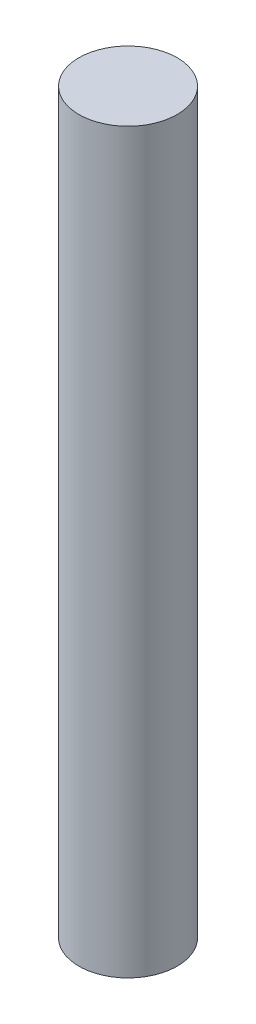
ISO-10303-21;
HEADER;
FILE_DESCRIPTION(('STEP AP214'),'2;1');
FILE_NAME('part.step','',(''),(''),'','','');
FILE_SCHEMA(('AUTOMOTIVE_DESIGN { 1 0 10303 214 1 1 1 1 }'));
ENDSEC;
DATA;
#1=APPLICATION_CONTEXT('core data for automotive mechanical design processes');
#2=APPLICATION_PROTOCOL_DEFINITION('international standard','automotive_design',2000,#1);
#3=PRODUCT_CONTEXT('',#1,'mechanical');
#4=PRODUCT('Part','Part','',(#3));
#5=PRODUCT_RELATED_PRODUCT_CATEGORY('part','',(#4));
#6=PRODUCT_DEFINITION_FORMATION('','',#4);
#7=PRODUCT_DEFINITION_CONTEXT('part definition',#1,'design');
#8=PRODUCT_DEFINITION('design','',#6,#7);
#9=PRODUCT_DEFINITION_SHAPE('','',#8);
#10=(LENGTH_UNIT() NAMED_UNIT(*) SI_UNIT(.MILLI.,.METRE.));
#11=(NAMED_UNIT(*) PLANE_ANGLE_UNIT() SI_UNIT($,.RADIAN.));
#12=(NAMED_UNIT(*) SI_UNIT($,.STERADIAN.) SOLID_ANGLE_UNIT());
#13=UNCERTAINTY_MEASURE_WITH_UNIT(LENGTH_MEASURE(1.E-05),#10,'distance_accuracy_value','');
#14=(GEOMETRIC_REPRESENTATION_CONTEXT(3) GLOBAL_UNCERTAINTY_ASSIGNED_CONTEXT((#13)) GLOBAL_UNIT_ASSIGNED_CONTEXT((#10,
#11,#12)) REPRESENTATION_CONTEXT('',''));
#15=CARTESIAN_POINT('',(0.,0.,0.));
#16=DIRECTION('',(0.,0.,1.));
#17=DIRECTION('',(1.,0.,0.));
#18=AXIS2_PLACEMENT_3D('',#15,#16,#17);
#19=CARTESIAN_POINT('',(0.,11.25,0.));
#20=DIRECTION('',(0.,-1.,0.));
#21=DIRECTION('',(0.,0.,-1.));
#22=AXIS2_PLACEMENT_3D('',#19,#20,#21);
#23=CYLINDRICAL_SURFACE('',#22,1.5);
#24=CARTESIAN_POINT('',(0.,11.25,0.));
#25=DIRECTION('',(0.,1.,0.));
#26=DIRECTION('',(0.,0.,1.));
#27=AXIS2_PLACEMENT_3D('',#24,#25,#26);
#28=CIRCLE('',#27,1.5);
#29=CARTESIAN_POINT('',(0.,11.25,-1.5));
#30=VERTEX_POINT('',#29);
#31=EDGE_CURVE('E10',#30,#30,#28,.T.);
#32=CARTESIAN_POINT('',(0.,-11.25,0.));
#33=DIRECTION('',(0.,1.,0.));
#34=DIRECTION('',(0.,0.,1.));
#35=AXIS2_PLACEMENT_3D('',#32,#33,#34);
#36=CIRCLE('',#35,1.5);
#37=CARTESIAN_POINT('',(0.,-11.25,-1.5));
#38=VERTEX_POINT('',#37);
#39=EDGE_CURVE('E34',#38,#38,#36,.T.);
#40=CARTESIAN_POINT('',(0.,11.25,-1.5));
#41=CARTESIAN_POINT('',(0.,11.015625,-1.5));
#42=CARTESIAN_POINT('',(0.,10.78125,-1.5));
#43=CARTESIAN_POINT('',(0.,10.3125,-1.5));
#44=CARTESIAN_POINT('',(0.,10.078125,-1.5));
#45=CARTESIAN_POINT('',(0.,9.609375,-1.5));
#46=CARTESIAN_POINT('',(0.,9.375,-1.5));
#47=CARTESIAN_POINT('',(0.,8.90625,-1.5));
#48=CARTESIAN_POINT('',(0.,8.671875,-1.5));
#49=CARTESIAN_POINT('',(0.,8.203125,-1.5));
#50=CARTESIAN_POINT('',(0.,7.96875,-1.5));
#51=CARTESIAN_POINT('',(0.,7.5,-1.5));
#52=CARTESIAN_POINT('',(0.,7.265625,-1.5));
#53=CARTESIAN_POINT('',(0.,6.796875,-1.5));
#54=CARTESIAN_POINT('',(0.,6.5625,-1.5));
#55=CARTESIAN_POINT('',(0.,6.09375,-1.5));
#56=CARTESIAN_POINT('',(0.,5.859375,-1.5));
#57=CARTESIAN_POINT('',(0.,5.390625,-1.5));
#58=CARTESIAN_POINT('',(0.,5.15625,-1.5));
#59=CARTESIAN_POINT('',(0.,4.6875,-1.5));
#60=CARTESIAN_POINT('',(0.,4.453125,-1.5));
#61=CARTESIAN_POINT('',(0.,3.984375,-1.5));
#62=CARTESIAN_POINT('',(0.,3.75,-1.5));
#63=CARTESIAN_POINT('',(0.,3.28125,-1.5));
#64=CARTESIAN_POINT('',(0.,3.046875,-1.5));
#65=CARTESIAN_POINT('',(0.,2.578125,-1.5));
#66=CARTESIAN_POINT('',(0.,2.34375,-1.5));
#67=CARTESIAN_POINT('',(0.,1.875,-1.5));
#68=CARTESIAN_POINT('',(0.,1.640625,-1.5));
#69=CARTESIAN_POINT('',(0.,1.171875,-1.5));
#70=CARTESIAN_POINT('',(0.,0.937499999999997,-1.5));
#71=CARTESIAN_POINT('',(0.,0.468749999999997,-1.5));
#72=CARTESIAN_POINT('',(0.,0.234374999999997,-1.5));
#73=CARTESIAN_POINT('',(0.,-0.234375000000004,-1.5));
#74=CARTESIAN_POINT('',(0.,-0.468750000000004,-1.5));
#75=CARTESIAN_POINT('',(0.,-0.937500000000004,-1.5));
#76=CARTESIAN_POINT('',(0.,-1.171875,-1.5));
#77=CARTESIAN_POINT('',(0.,-1.640625,-1.5));
#78=CARTESIAN_POINT('',(0.,-1.875,-1.5));
#79=CARTESIAN_POINT('',(0.,-2.34375,-1.5));
#80=CARTESIAN_POINT('',(0.,-2.578125,-1.5));
#81=CARTESIAN_POINT('',(0.,-3.046875,-1.5));
#82=CARTESIAN_POINT('',(0.,-3.28125,-1.5));
#83=CARTESIAN_POINT('',(0.,-3.75,-1.5));
#84=CARTESIAN_POINT('',(0.,-3.984375,-1.5));
#85=CARTESIAN_POINT('',(0.,-4.453125,-1.5));
#86=CARTESIAN_POINT('',(0.,-4.6875,-1.5));
#87=CARTESIAN_POINT('',(0.,-5.15625,-1.5));
#88=CARTESIAN_POINT('',(0.,-5.390625,-1.5));
#89=CARTESIAN_POINT('',(0.,-5.859375,-1.5));
#90=CARTESIAN_POINT('',(0.,-6.09375,-1.5));
#91=CARTESIAN_POINT('',(0.,-6.5625,-1.5));
#92=CARTESIAN_POINT('',(0.,-6.796875,-1.5));
#93=CARTESIAN_POINT('',(0.,-7.265625,-1.5));
#94=CARTESIAN_POINT('',(0.,-7.5,-1.5));
#95=CARTESIAN_POINT('',(0.,-7.96875,-1.5));
#96=CARTESIAN_POINT('',(0.,-8.203125,-1.5));
#97=CARTESIAN_POINT('',(0.,-8.671875,-1.5));
#98=CARTESIAN_POINT('',(0.,-8.90625,-1.5));
#99=CARTESIAN_POINT('',(0.,-9.375,-1.5));
#100=CARTESIAN_POINT('',(0.,-9.609375,-1.5));
#101=CARTESIAN_POINT('',(0.,-10.078125,-1.5));
#102=CARTESIAN_POINT('',(0.,-10.3125,-1.5));
#103=CARTESIAN_POINT('',(0.,-10.78125,-1.5));
#104=CARTESIAN_POINT('',(0.,-11.015625,-1.5));
#105=CARTESIAN_POINT('',(0.,-11.25,-1.5));
#106=B_SPLINE_CURVE_WITH_KNOTS('',3,(#40,#41,#42,#43,#44,#45,#46,#47,#48,#49,#50,#51,#52,#53,
#54,#55,#56,#57,#58,#59,#60,#61,#62,#63,#64,#65,#66,#67,#68,#69,#70,#71,#72,#73,#74,#75,#76,#77,
#78,#79,#80,#81,#82,#83,#84,#85,#86,#87,#88,#89,#90,#91,#92,#93,#94,#95,#96,#97,#98,#99,#100,
#101,#102,#103,#104,#105),.UNSPECIFIED.,.F.,.F.,(4,2,2,2,2,2,2,2,2,2,2,2,2,2,2,2,2,2,2,2,2,2,2,
2,2,2,2,2,2,2,2,2,4),(0.,0.703124999999999,1.40625,2.109375,2.8125,3.515625,4.21875,4.921875,
5.625,6.328125,7.03125,7.734375,8.4375,9.140625,9.84375,10.546875,11.25,11.953125,12.65625,
13.359375,14.0625,14.765625,15.46875,16.171875,16.875,17.578125,18.28125,18.984375,19.6875,
20.390625,21.09375,21.796875,22.5),.UNSPECIFIED.);
#107=EDGE_CURVE('BSEAM31',#30,#38,#106,.T.);
#108=ORIENTED_EDGE('',*,*,#31,.F.);
#109=ORIENTED_EDGE('',*,*,#39,.T.);
#110=ORIENTED_EDGE('',*,*,#107,.T.);
#111=ORIENTED_EDGE('',*,*,#107,.F.);
#112=EDGE_LOOP('',(#108,#110,#109,#111));
#113=FACE_BOUND('',#112,.T.);
#114=ADVANCED_FACE('F31',(#113),#23,.T.);
#115=CARTESIAN_POINT('',(0.,11.25,0.));
#116=DIRECTION('',(0.,1.,0.));
#117=DIRECTION('',(0.,0.,1.));
#118=AXIS2_PLACEMENT_3D('',#115,#116,#117);
#119=PLANE('',#118);
#120=ORIENTED_EDGE('',*,*,#31,.T.);
#121=EDGE_LOOP('',(#120));
#122=FACE_BOUND('',#121,.T.);
#123=ADVANCED_FACE('F46',(#122),#119,.T.);
#124=CARTESIAN_POINT('',(0.,-11.25,0.));
#125=DIRECTION('',(0.,1.,0.));
#126=DIRECTION('',(0.,0.,1.));
#127=AXIS2_PLACEMENT_3D('',#124,#125,#126);
#128=PLANE('',#127);
#129=ORIENTED_EDGE('',*,*,#39,.F.);
#130=EDGE_LOOP('',(#129));
#131=FACE_BOUND('',#130,.T.);
#132=ADVANCED_FACE('F44',(#131),#128,.F.);
#133=CLOSED_SHELL('',(#114,#123,#132));
#134=MANIFOLD_SOLID_BREP('B2',#133);
#135=ADVANCED_BREP_SHAPE_REPRESENTATION('',(#18,#134),#14);
#136=SHAPE_DEFINITION_REPRESENTATION(#9,#135);
ENDSEC;
END-ISO-10303-21;
